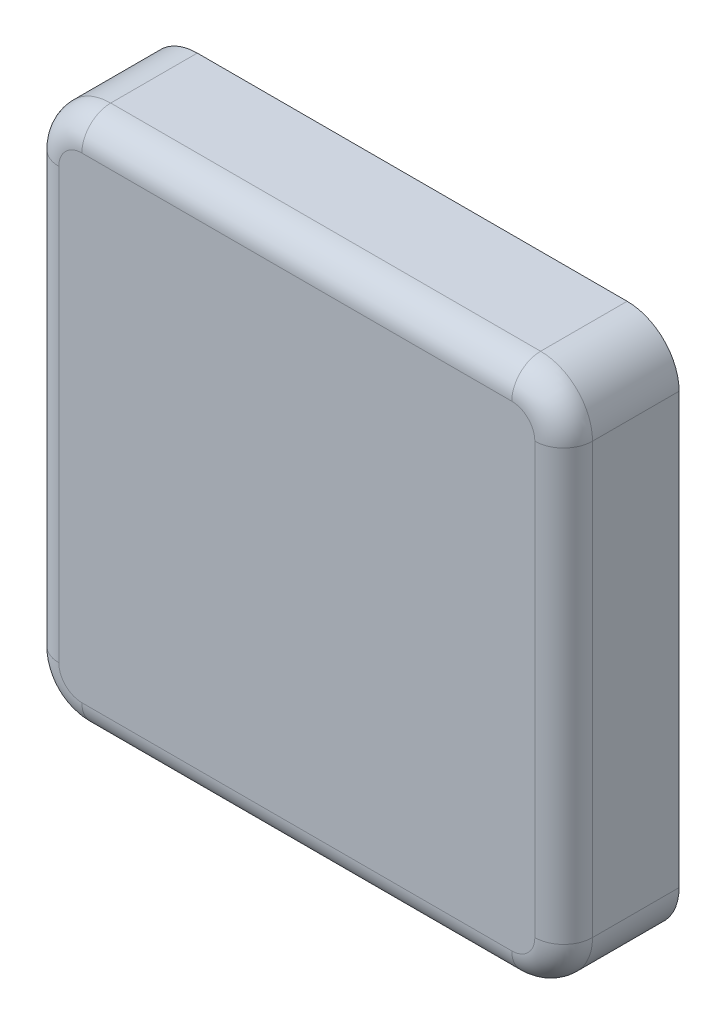
ISO-10303-21;
HEADER;
FILE_DESCRIPTION(('STEP AP214'),'2;1');
FILE_NAME('part.step','',(''),(''),'','','');
FILE_SCHEMA(('AUTOMOTIVE_DESIGN { 1 0 10303 214 1 1 1 1 }'));
ENDSEC;
DATA;
#1=APPLICATION_CONTEXT('core data for automotive mechanical design processes');
#2=APPLICATION_PROTOCOL_DEFINITION('international standard','automotive_design',2000,#1);
#3=PRODUCT_CONTEXT('',#1,'mechanical');
#4=PRODUCT('Part','Part','',(#3));
#5=PRODUCT_RELATED_PRODUCT_CATEGORY('part','',(#4));
#6=PRODUCT_DEFINITION_FORMATION('','',#4);
#7=PRODUCT_DEFINITION_CONTEXT('part definition',#1,'design');
#8=PRODUCT_DEFINITION('design','',#6,#7);
#9=PRODUCT_DEFINITION_SHAPE('','',#8);
#10=(LENGTH_UNIT() NAMED_UNIT(*) SI_UNIT(.MILLI.,.METRE.));
#11=(NAMED_UNIT(*) PLANE_ANGLE_UNIT() SI_UNIT($,.RADIAN.));
#12=(NAMED_UNIT(*) SI_UNIT($,.STERADIAN.) SOLID_ANGLE_UNIT());
#13=UNCERTAINTY_MEASURE_WITH_UNIT(LENGTH_MEASURE(1.E-05),#10,'distance_accuracy_value','');
#14=(GEOMETRIC_REPRESENTATION_CONTEXT(3) GLOBAL_UNCERTAINTY_ASSIGNED_CONTEXT((#13)) GLOBAL_UNIT_ASSIGNED_CONTEXT((#10,
#11,#12)) REPRESENTATION_CONTEXT('',''));
#15=CARTESIAN_POINT('',(0.,0.,0.));
#16=DIRECTION('',(0.,0.,1.));
#17=DIRECTION('',(1.,0.,0.));
#18=AXIS2_PLACEMENT_3D('',#15,#16,#17);
#19=CARTESIAN_POINT('',(0.,0.,0.));
#20=DIRECTION('',(0.,0.,-1.));
#21=DIRECTION('',(-1.,0.,0.));
#22=AXIS2_PLACEMENT_3D('',#19,#20,#21);
#23=PLANE('',#22);
#24=DIRECTION('',(-1.,0.,0.));
#25=VECTOR('',#24,1.);
#26=CARTESIAN_POINT('',(0.,8.65,0.));
#27=LINE('',#26,#25);
#28=CARTESIAN_POINT('',(8.65,8.65,0.));
#29=VERTEX_POINT('',#28);
#30=CARTESIAN_POINT('',(-8.65,8.65,0.));
#31=VERTEX_POINT('',#30);
#32=EDGE_CURVE('E291',#29,#31,#27,.T.);
#33=ORIENTED_EDGE('',*,*,#32,.T.);
#34=DIRECTION('',(0.,-1.,0.));
#35=VECTOR('',#34,1.);
#36=CARTESIAN_POINT('',(-8.65,0.,0.));
#37=LINE('',#36,#35);
#38=CARTESIAN_POINT('',(-8.65,-8.65,0.));
#39=VERTEX_POINT('',#38);
#40=EDGE_CURVE('E293',#31,#39,#37,.T.);
#41=ORIENTED_EDGE('',*,*,#40,.T.);
#42=DIRECTION('',(1.,0.,0.));
#43=VECTOR('',#42,1.);
#44=CARTESIAN_POINT('',(0.,-8.65,0.));
#45=LINE('',#44,#43);
#46=CARTESIAN_POINT('',(8.65,-8.65,0.));
#47=VERTEX_POINT('',#46);
#48=EDGE_CURVE('E267',#39,#47,#45,.T.);
#49=ORIENTED_EDGE('',*,*,#48,.T.);
#50=DIRECTION('',(0.,1.,0.));
#51=VECTOR('',#50,1.);
#52=CARTESIAN_POINT('',(8.65,0.,0.));
#53=LINE('',#52,#51);
#54=EDGE_CURVE('E289',#47,#29,#53,.T.);
#55=ORIENTED_EDGE('',*,*,#54,.T.);
#56=EDGE_LOOP('',(#33,#41,#49,#55));
#57=FACE_BOUND('',#56,.T.);
#58=DIRECTION('',(0.,-1.,0.));
#59=VECTOR('',#58,1.);
#60=CARTESIAN_POINT('',(-9.25,-9.25,0.));
#61=LINE('',#60,#59);
#62=CARTESIAN_POINT('',(-9.25,7.45,0.));
#63=VERTEX_POINT('',#62);
#64=CARTESIAN_POINT('',(-9.25,-7.45,0.));
#65=VERTEX_POINT('',#64);
#66=EDGE_CURVE('E199',#63,#65,#61,.T.);
#67=ORIENTED_EDGE('',*,*,#66,.F.);
#68=CARTESIAN_POINT('',(-7.45,7.45,0.));
#69=DIRECTION('',(0.,0.,-1.));
#70=DIRECTION('',(-1.,0.,0.));
#71=AXIS2_PLACEMENT_3D('',#68,#69,#70);
#72=CIRCLE('',#71,1.8);
#73=CARTESIAN_POINT('',(-7.45,9.25,0.));
#74=VERTEX_POINT('',#73);
#75=EDGE_CURVE('E216',#63,#74,#72,.T.);
#76=ORIENTED_EDGE('',*,*,#75,.T.);
#77=DIRECTION('',(-1.,0.,0.));
#78=VECTOR('',#77,1.);
#79=CARTESIAN_POINT('',(-9.25,9.25,0.));
#80=LINE('',#79,#78);
#81=CARTESIAN_POINT('',(7.45,9.25,0.));
#82=VERTEX_POINT('',#81);
#83=EDGE_CURVE('E195',#82,#74,#80,.T.);
#84=ORIENTED_EDGE('',*,*,#83,.F.);
#85=CARTESIAN_POINT('',(7.45,7.45,0.));
#86=DIRECTION('',(0.,0.,-1.));
#87=DIRECTION('',(-1.,0.,0.));
#88=AXIS2_PLACEMENT_3D('',#85,#86,#87);
#89=CIRCLE('',#88,1.8);
#90=CARTESIAN_POINT('',(9.25,7.45,0.));
#91=VERTEX_POINT('',#90);
#92=EDGE_CURVE('E210',#82,#91,#89,.T.);
#93=ORIENTED_EDGE('',*,*,#92,.T.);
#94=DIRECTION('',(0.,1.,0.));
#95=VECTOR('',#94,1.);
#96=CARTESIAN_POINT('',(9.25,-9.25,0.));
#97=LINE('',#96,#95);
#98=CARTESIAN_POINT('',(9.25,-7.45,0.));
#99=VERTEX_POINT('',#98);
#100=EDGE_CURVE('E192',#99,#91,#97,.T.);
#101=ORIENTED_EDGE('',*,*,#100,.F.);
#102=CARTESIAN_POINT('',(7.45,-7.45,0.));
#103=DIRECTION('',(0.,0.,-1.));
#104=DIRECTION('',(-1.,0.,0.));
#105=AXIS2_PLACEMENT_3D('',#102,#103,#104);
#106=CIRCLE('',#105,1.8);
#107=CARTESIAN_POINT('',(7.45,-9.25,0.));
#108=VERTEX_POINT('',#107);
#109=EDGE_CURVE('E212',#99,#108,#106,.T.);
#110=ORIENTED_EDGE('',*,*,#109,.T.);
#111=DIRECTION('',(1.,0.,0.));
#112=VECTOR('',#111,1.);
#113=CARTESIAN_POINT('',(-9.25,-9.25,0.));
#114=LINE('',#113,#112);
#115=CARTESIAN_POINT('',(-7.45,-9.25,0.));
#116=VERTEX_POINT('',#115);
#117=EDGE_CURVE('E202',#116,#108,#114,.T.);
#118=ORIENTED_EDGE('',*,*,#117,.F.);
#119=CARTESIAN_POINT('',(-7.45,-7.45,0.));
#120=DIRECTION('',(0.,0.,-1.));
#121=DIRECTION('',(-1.,0.,0.));
#122=AXIS2_PLACEMENT_3D('',#119,#120,#121);
#123=CIRCLE('',#122,1.8);
#124=EDGE_CURVE('E214',#116,#65,#123,.T.);
#125=ORIENTED_EDGE('',*,*,#124,.T.);
#126=EDGE_LOOP('',(#67,#76,#84,#93,#101,#110,#118,#125));
#127=FACE_BOUND('',#126,.T.);
#128=ADVANCED_FACE('F39',(#57,#127),#23,.T.);
#129=CARTESIAN_POINT('',(9.25,-9.25,4.));
#130=DIRECTION('',(-1.,0.,0.));
#131=DIRECTION('',(0.,0.,1.));
#132=AXIS2_PLACEMENT_3D('',#129,#130,#131);
#133=PLANE('',#132);
#134=DIRECTION('',(0.,0.,-1.));
#135=VECTOR('',#134,1.);
#136=CARTESIAN_POINT('',(9.25,7.45,4.));
#137=LINE('',#136,#135);
#138=CARTESIAN_POINT('',(9.25,7.45,3.));
#139=VERTEX_POINT('',#138);
#140=EDGE_CURVE('E228',#91,#139,#137,.F.);
#141=ORIENTED_EDGE('',*,*,#140,.T.);
#142=DIRECTION('',(0.,1.,0.));
#143=VECTOR('',#142,1.);
#144=CARTESIAN_POINT('',(9.25,-9.25,3.));
#145=LINE('',#144,#143);
#146=CARTESIAN_POINT('',(9.25,-7.45,3.));
#147=VERTEX_POINT('',#146);
#148=EDGE_CURVE('E253',#139,#147,#145,.F.);
#149=ORIENTED_EDGE('',*,*,#148,.T.);
#150=DIRECTION('',(0.,0.,-1.));
#151=VECTOR('',#150,1.);
#152=CARTESIAN_POINT('',(9.25,-7.45,4.));
#153=LINE('',#152,#151);
#154=EDGE_CURVE('E231',#147,#99,#153,.T.);
#155=ORIENTED_EDGE('',*,*,#154,.T.);
#156=ORIENTED_EDGE('',*,*,#100,.T.);
#157=EDGE_LOOP('',(#141,#149,#155,#156));
#158=FACE_BOUND('',#157,.T.);
#159=ADVANCED_FACE('F332',(#158),#133,.F.);
#160=CARTESIAN_POINT('',(-9.25,9.25,4.));
#161=DIRECTION('',(0.,-1.,0.));
#162=DIRECTION('',(0.,0.,-1.));
#163=AXIS2_PLACEMENT_3D('',#160,#161,#162);
#164=PLANE('',#163);
#165=DIRECTION('',(0.,0.,-1.));
#166=VECTOR('',#165,1.);
#167=CARTESIAN_POINT('',(-7.45,9.25,4.));
#168=LINE('',#167,#166);
#169=CARTESIAN_POINT('',(-7.45,9.25,3.));
#170=VERTEX_POINT('',#169);
#171=EDGE_CURVE('E220',#74,#170,#168,.F.);
#172=ORIENTED_EDGE('',*,*,#171,.T.);
#173=DIRECTION('',(-1.,0.,0.));
#174=VECTOR('',#173,1.);
#175=CARTESIAN_POINT('',(-9.25,9.25,3.));
#176=LINE('',#175,#174);
#177=CARTESIAN_POINT('',(7.45,9.25,3.));
#178=VERTEX_POINT('',#177);
#179=EDGE_CURVE('E265',#170,#178,#176,.F.);
#180=ORIENTED_EDGE('',*,*,#179,.T.);
#181=DIRECTION('',(0.,0.,-1.));
#182=VECTOR('',#181,1.);
#183=CARTESIAN_POINT('',(7.45,9.25,4.));
#184=LINE('',#183,#182);
#185=EDGE_CURVE('E218',#178,#82,#184,.T.);
#186=ORIENTED_EDGE('',*,*,#185,.T.);
#187=ORIENTED_EDGE('',*,*,#83,.T.);
#188=EDGE_LOOP('',(#172,#180,#186,#187));
#189=FACE_BOUND('',#188,.T.);
#190=ADVANCED_FACE('F372',(#189),#164,.F.);
#191=CARTESIAN_POINT('',(-9.25,-9.25,4.));
#192=DIRECTION('',(1.,0.,0.));
#193=DIRECTION('',(0.,0.,-1.));
#194=AXIS2_PLACEMENT_3D('',#191,#192,#193);
#195=PLANE('',#194);
#196=DIRECTION('',(0.,0.,-1.));
#197=VECTOR('',#196,1.);
#198=CARTESIAN_POINT('',(-9.25,-7.45,4.));
#199=LINE('',#198,#197);
#200=CARTESIAN_POINT('',(-9.25,-7.45,3.));
#201=VERTEX_POINT('',#200);
#202=EDGE_CURVE('E205',#65,#201,#199,.F.);
#203=ORIENTED_EDGE('',*,*,#202,.T.);
#204=DIRECTION('',(0.,-1.,0.));
#205=VECTOR('',#204,1.);
#206=CARTESIAN_POINT('',(-9.25,-9.25,3.));
#207=LINE('',#206,#205);
#208=CARTESIAN_POINT('',(-9.25,7.45,3.));
#209=VERTEX_POINT('',#208);
#210=EDGE_CURVE('E261',#201,#209,#207,.F.);
#211=ORIENTED_EDGE('',*,*,#210,.T.);
#212=DIRECTION('',(0.,0.,-1.));
#213=VECTOR('',#212,1.);
#214=CARTESIAN_POINT('',(-9.25,7.45,4.));
#215=LINE('',#214,#213);
#216=EDGE_CURVE('E208',#209,#63,#215,.T.);
#217=ORIENTED_EDGE('',*,*,#216,.T.);
#218=ORIENTED_EDGE('',*,*,#66,.T.);
#219=EDGE_LOOP('',(#203,#211,#217,#218));
#220=FACE_BOUND('',#219,.T.);
#221=ADVANCED_FACE('F341',(#220),#195,.F.);
#222=CARTESIAN_POINT('',(-9.25,-9.25,4.));
#223=DIRECTION('',(0.,1.,0.));
#224=DIRECTION('',(0.,0.,1.));
#225=AXIS2_PLACEMENT_3D('',#222,#223,#224);
#226=PLANE('',#225);
#227=DIRECTION('',(0.,0.,-1.));
#228=VECTOR('',#227,1.);
#229=CARTESIAN_POINT('',(7.45,-9.25,4.));
#230=LINE('',#229,#228);
#231=CARTESIAN_POINT('',(7.45,-9.25,3.));
#232=VERTEX_POINT('',#231);
#233=EDGE_CURVE('E223',#108,#232,#230,.F.);
#234=ORIENTED_EDGE('',*,*,#233,.T.);
#235=DIRECTION('',(1.,0.,0.));
#236=VECTOR('',#235,1.);
#237=CARTESIAN_POINT('',(-9.25,-9.25,3.));
#238=LINE('',#237,#236);
#239=CARTESIAN_POINT('',(-7.45,-9.25,3.));
#240=VERTEX_POINT('',#239);
#241=EDGE_CURVE('E257',#232,#240,#238,.F.);
#242=ORIENTED_EDGE('',*,*,#241,.T.);
#243=DIRECTION('',(0.,0.,-1.));
#244=VECTOR('',#243,1.);
#245=CARTESIAN_POINT('',(-7.45,-9.25,4.));
#246=LINE('',#245,#244);
#247=EDGE_CURVE('E226',#240,#116,#246,.T.);
#248=ORIENTED_EDGE('',*,*,#247,.T.);
#249=ORIENTED_EDGE('',*,*,#117,.T.);
#250=EDGE_LOOP('',(#234,#242,#248,#249));
#251=FACE_BOUND('',#250,.T.);
#252=ADVANCED_FACE('F399',(#251),#226,.F.);
#253=CARTESIAN_POINT('',(0.,0.,4.));
#254=DIRECTION('',(0.,0.,-1.));
#255=DIRECTION('',(-1.,0.,0.));
#256=AXIS2_PLACEMENT_3D('',#253,#254,#255);
#257=PLANE('',#256);
#258=DIRECTION('',(0.,1.,0.));
#259=VECTOR('',#258,1.);
#260=CARTESIAN_POINT('',(8.25,0.,4.));
#261=LINE('',#260,#259);
#262=CARTESIAN_POINT('',(8.25,-7.45,4.));
#263=VERTEX_POINT('',#262);
#264=CARTESIAN_POINT('',(8.25,7.45,4.));
#265=VERTEX_POINT('',#264);
#266=EDGE_CURVE('E245',#263,#265,#261,.T.);
#267=ORIENTED_EDGE('',*,*,#266,.T.);
#268=CARTESIAN_POINT('',(7.45,7.45,4.));
#269=DIRECTION('',(0.,0.,-1.));
#270=DIRECTION('',(-1.,0.,0.));
#271=AXIS2_PLACEMENT_3D('',#268,#269,#270);
#272=CIRCLE('',#271,0.8);
#273=CARTESIAN_POINT('',(7.45,8.25,4.));
#274=VERTEX_POINT('',#273);
#275=EDGE_CURVE('E247',#265,#274,#272,.F.);
#276=ORIENTED_EDGE('',*,*,#275,.T.);
#277=DIRECTION('',(-1.,0.,0.));
#278=VECTOR('',#277,1.);
#279=CARTESIAN_POINT('',(0.,8.25,4.));
#280=LINE('',#279,#278);
#281=CARTESIAN_POINT('',(-7.45,8.25,4.));
#282=VERTEX_POINT('',#281);
#283=EDGE_CURVE('E233',#274,#282,#280,.T.);
#284=ORIENTED_EDGE('',*,*,#283,.T.);
#285=CARTESIAN_POINT('',(-7.45,7.45,4.));
#286=DIRECTION('',(0.,0.,-1.));
#287=DIRECTION('',(-1.,0.,0.));
#288=AXIS2_PLACEMENT_3D('',#285,#286,#287);
#289=CIRCLE('',#288,0.8);
#290=CARTESIAN_POINT('',(-8.25,7.45,4.));
#291=VERTEX_POINT('',#290);
#292=EDGE_CURVE('E235',#282,#291,#289,.F.);
#293=ORIENTED_EDGE('',*,*,#292,.T.);
#294=DIRECTION('',(0.,-1.,0.));
#295=VECTOR('',#294,1.);
#296=CARTESIAN_POINT('',(-8.25,0.,4.));
#297=LINE('',#296,#295);
#298=CARTESIAN_POINT('',(-8.25,-7.45,4.));
#299=VERTEX_POINT('',#298);
#300=EDGE_CURVE('E237',#291,#299,#297,.T.);
#301=ORIENTED_EDGE('',*,*,#300,.T.);
#302=CARTESIAN_POINT('',(-7.45,-7.45,4.));
#303=DIRECTION('',(0.,0.,-1.));
#304=DIRECTION('',(-1.,0.,0.));
#305=AXIS2_PLACEMENT_3D('',#302,#303,#304);
#306=CIRCLE('',#305,0.8);
#307=CARTESIAN_POINT('',(-7.45,-8.25,4.));
#308=VERTEX_POINT('',#307);
#309=EDGE_CURVE('E239',#299,#308,#306,.F.);
#310=ORIENTED_EDGE('',*,*,#309,.T.);
#311=DIRECTION('',(1.,0.,0.));
#312=VECTOR('',#311,1.);
#313=CARTESIAN_POINT('',(0.,-8.25,4.));
#314=LINE('',#313,#312);
#315=CARTESIAN_POINT('',(7.45,-8.25,4.));
#316=VERTEX_POINT('',#315);
#317=EDGE_CURVE('E241',#308,#316,#314,.T.);
#318=ORIENTED_EDGE('',*,*,#317,.T.);
#319=CARTESIAN_POINT('',(7.45,-7.45,4.));
#320=DIRECTION('',(0.,0.,-1.));
#321=DIRECTION('',(-1.,0.,0.));
#322=AXIS2_PLACEMENT_3D('',#319,#320,#321);
#323=CIRCLE('',#322,0.8);
#324=EDGE_CURVE('E243',#316,#263,#323,.F.);
#325=ORIENTED_EDGE('',*,*,#324,.T.);
#326=EDGE_LOOP('',(#267,#276,#284,#293,#301,#310,#318,#325));
#327=FACE_BOUND('',#326,.T.);
#328=ADVANCED_FACE('F360',(#327),#257,.F.);
#329=CARTESIAN_POINT('',(-7.45,7.45,4.));
#330=DIRECTION('',(0.,0.,-1.));
#331=DIRECTION('',(-1.,0.,0.));
#332=AXIS2_PLACEMENT_3D('',#329,#330,#331);
#333=CYLINDRICAL_SURFACE('',#332,1.8);
#334=ORIENTED_EDGE('',*,*,#216,.F.);
#335=CARTESIAN_POINT('',(-7.45,7.45,3.));
#336=DIRECTION('',(0.,0.,-1.));
#337=DIRECTION('',(-1.,0.,0.));
#338=AXIS2_PLACEMENT_3D('',#335,#336,#337);
#339=CIRCLE('',#338,1.8);
#340=EDGE_CURVE('E263',#209,#170,#339,.T.);
#341=ORIENTED_EDGE('',*,*,#340,.T.);
#342=ORIENTED_EDGE('',*,*,#171,.F.);
#343=ORIENTED_EDGE('',*,*,#75,.F.);
#344=EDGE_LOOP('',(#334,#341,#342,#343));
#345=FACE_BOUND('',#344,.T.);
#346=ADVANCED_FACE('F368',(#345),#333,.T.);
#347=CARTESIAN_POINT('',(-7.45,-7.45,4.));
#348=DIRECTION('',(0.,0.,-1.));
#349=DIRECTION('',(-1.,0.,0.));
#350=AXIS2_PLACEMENT_3D('',#347,#348,#349);
#351=CYLINDRICAL_SURFACE('',#350,1.8);
#352=ORIENTED_EDGE('',*,*,#247,.F.);
#353=CARTESIAN_POINT('',(-7.45,-7.45,3.));
#354=DIRECTION('',(0.,0.,-1.));
#355=DIRECTION('',(-1.,0.,0.));
#356=AXIS2_PLACEMENT_3D('',#353,#354,#355);
#357=CIRCLE('',#356,1.8);
#358=EDGE_CURVE('E259',#240,#201,#357,.T.);
#359=ORIENTED_EDGE('',*,*,#358,.T.);
#360=ORIENTED_EDGE('',*,*,#202,.F.);
#361=ORIENTED_EDGE('',*,*,#124,.F.);
#362=EDGE_LOOP('',(#352,#359,#360,#361));
#363=FACE_BOUND('',#362,.T.);
#364=ADVANCED_FACE('F346',(#363),#351,.T.);
#365=CARTESIAN_POINT('',(7.45,-7.45,4.));
#366=DIRECTION('',(0.,0.,-1.));
#367=DIRECTION('',(-1.,0.,0.));
#368=AXIS2_PLACEMENT_3D('',#365,#366,#367);
#369=CYLINDRICAL_SURFACE('',#368,1.8);
#370=ORIENTED_EDGE('',*,*,#154,.F.);
#371=CARTESIAN_POINT('',(7.45,-7.45,3.));
#372=DIRECTION('',(0.,0.,-1.));
#373=DIRECTION('',(-1.,0.,0.));
#374=AXIS2_PLACEMENT_3D('',#371,#372,#373);
#375=CIRCLE('',#374,1.8);
#376=EDGE_CURVE('E255',#147,#232,#375,.T.);
#377=ORIENTED_EDGE('',*,*,#376,.T.);
#378=ORIENTED_EDGE('',*,*,#233,.F.);
#379=ORIENTED_EDGE('',*,*,#109,.F.);
#380=EDGE_LOOP('',(#370,#377,#378,#379));
#381=FACE_BOUND('',#380,.T.);
#382=ADVANCED_FACE('F400',(#381),#369,.T.);
#383=CARTESIAN_POINT('',(7.45,7.45,4.));
#384=DIRECTION('',(0.,0.,-1.));
#385=DIRECTION('',(-1.,0.,0.));
#386=AXIS2_PLACEMENT_3D('',#383,#384,#385);
#387=CYLINDRICAL_SURFACE('',#386,1.8);
#388=ORIENTED_EDGE('',*,*,#185,.F.);
#389=CARTESIAN_POINT('',(7.45,7.45,3.));
#390=DIRECTION('',(0.,0.,-1.));
#391=DIRECTION('',(-1.,0.,0.));
#392=AXIS2_PLACEMENT_3D('',#389,#390,#391);
#393=CIRCLE('',#392,1.8);
#394=EDGE_CURVE('E250',#178,#139,#393,.T.);
#395=ORIENTED_EDGE('',*,*,#394,.T.);
#396=ORIENTED_EDGE('',*,*,#140,.F.);
#397=ORIENTED_EDGE('',*,*,#92,.F.);
#398=EDGE_LOOP('',(#388,#395,#396,#397));
#399=FACE_BOUND('',#398,.T.);
#400=ADVANCED_FACE('F390',(#399),#387,.T.);
#401=CARTESIAN_POINT('',(-7.45,-7.45,3.));
#402=DIRECTION('',(0.,0.,-1.));
#403=DIRECTION('',(-1.,0.,0.));
#404=AXIS2_PLACEMENT_3D('',#401,#402,#403);
#405=DEGENERATE_TOROIDAL_SURFACE('',#404,0.8,1.,.T.);
#406=CARTESIAN_POINT('',(-8.25,-7.45,3.));
#407=DIRECTION('',(0.,1.,0.));
#408=DIRECTION('',(0.,0.,1.));
#409=AXIS2_PLACEMENT_3D('',#406,#407,#408);
#410=CIRCLE('',#409,1.);
#411=EDGE_CURVE('E283',#201,#299,#410,.T.);
#412=ORIENTED_EDGE('',*,*,#411,.F.);
#413=ORIENTED_EDGE('',*,*,#358,.F.);
#414=CARTESIAN_POINT('',(-7.45,-8.25,3.));
#415=DIRECTION('',(1.,0.,0.));
#416=DIRECTION('',(0.,0.,-1.));
#417=AXIS2_PLACEMENT_3D('',#414,#415,#416);
#418=CIRCLE('',#417,1.);
#419=EDGE_CURVE('E196',#308,#240,#418,.T.);
#420=ORIENTED_EDGE('',*,*,#419,.F.);
#421=ORIENTED_EDGE('',*,*,#309,.F.);
#422=EDGE_LOOP('',(#412,#413,#420,#421));
#423=FACE_BOUND('',#422,.T.);
#424=ADVANCED_FACE('F350',(#423),#405,.T.);
#425=CARTESIAN_POINT('',(0.,-8.25,3.));
#426=DIRECTION('',(1.,0.,0.));
#427=DIRECTION('',(0.,0.,-1.));
#428=AXIS2_PLACEMENT_3D('',#425,#426,#427);
#429=CYLINDRICAL_SURFACE('',#428,1.);
#430=ORIENTED_EDGE('',*,*,#419,.T.);
#431=ORIENTED_EDGE('',*,*,#241,.F.);
#432=CARTESIAN_POINT('',(7.45,-8.25,3.));
#433=DIRECTION('',(1.,0.,0.));
#434=DIRECTION('',(0.,0.,-1.));
#435=AXIS2_PLACEMENT_3D('',#432,#433,#434);
#436=CIRCLE('',#435,1.);
#437=EDGE_CURVE('E280',#316,#232,#436,.T.);
#438=ORIENTED_EDGE('',*,*,#437,.F.);
#439=ORIENTED_EDGE('',*,*,#317,.F.);
#440=EDGE_LOOP('',(#430,#431,#438,#439));
#441=FACE_BOUND('',#440,.T.);
#442=ADVANCED_FACE('F356',(#441),#429,.T.);
#443=CARTESIAN_POINT('',(-8.25,0.,3.));
#444=DIRECTION('',(0.,-1.,0.));
#445=DIRECTION('',(0.,0.,-1.));
#446=AXIS2_PLACEMENT_3D('',#443,#444,#445);
#447=CYLINDRICAL_SURFACE('',#446,1.);
#448=ORIENTED_EDGE('',*,*,#411,.T.);
#449=ORIENTED_EDGE('',*,*,#300,.F.);
#450=CARTESIAN_POINT('',(-8.25,7.45,3.));
#451=DIRECTION('',(0.,1.,0.));
#452=DIRECTION('',(0.,0.,1.));
#453=AXIS2_PLACEMENT_3D('',#450,#451,#452);
#454=CIRCLE('',#453,1.);
#455=EDGE_CURVE('E277',#209,#291,#454,.T.);
#456=ORIENTED_EDGE('',*,*,#455,.F.);
#457=ORIENTED_EDGE('',*,*,#210,.F.);
#458=EDGE_LOOP('',(#448,#449,#456,#457));
#459=FACE_BOUND('',#458,.T.);
#460=ADVANCED_FACE('F364',(#459),#447,.T.);
#461=CARTESIAN_POINT('',(7.45,-7.45,3.));
#462=DIRECTION('',(0.,0.,-1.));
#463=DIRECTION('',(-1.,0.,0.));
#464=AXIS2_PLACEMENT_3D('',#461,#462,#463);
#465=DEGENERATE_TOROIDAL_SURFACE('',#464,0.8,1.,.T.);
#466=ORIENTED_EDGE('',*,*,#437,.T.);
#467=ORIENTED_EDGE('',*,*,#376,.F.);
#468=CARTESIAN_POINT('',(8.25,-7.45,3.));
#469=DIRECTION('',(0.,1.,0.));
#470=DIRECTION('',(0.,0.,1.));
#471=AXIS2_PLACEMENT_3D('',#468,#469,#470);
#472=CIRCLE('',#471,1.);
#473=EDGE_CURVE('E274',#263,#147,#472,.T.);
#474=ORIENTED_EDGE('',*,*,#473,.F.);
#475=ORIENTED_EDGE('',*,*,#324,.F.);
#476=EDGE_LOOP('',(#466,#467,#474,#475));
#477=FACE_BOUND('',#476,.T.);
#478=ADVANCED_FACE('F403',(#477),#465,.T.);
#479=CARTESIAN_POINT('',(-7.45,7.45,3.));
#480=DIRECTION('',(0.,0.,-1.));
#481=DIRECTION('',(-1.,0.,0.));
#482=AXIS2_PLACEMENT_3D('',#479,#480,#481);
#483=DEGENERATE_TOROIDAL_SURFACE('',#482,0.8,1.,.T.);
#484=ORIENTED_EDGE('',*,*,#455,.T.);
#485=ORIENTED_EDGE('',*,*,#292,.F.);
#486=CARTESIAN_POINT('',(-7.45,8.25,3.));
#487=DIRECTION('',(1.,0.,0.));
#488=DIRECTION('',(0.,0.,-1.));
#489=AXIS2_PLACEMENT_3D('',#486,#487,#488);
#490=CIRCLE('',#489,1.);
#491=EDGE_CURVE('E271',#170,#282,#490,.T.);
#492=ORIENTED_EDGE('',*,*,#491,.F.);
#493=ORIENTED_EDGE('',*,*,#340,.F.);
#494=EDGE_LOOP('',(#484,#485,#492,#493));
#495=FACE_BOUND('',#494,.T.);
#496=ADVANCED_FACE('F377',(#495),#483,.T.);
#497=CARTESIAN_POINT('',(8.25,0.,3.));
#498=DIRECTION('',(0.,1.,0.));
#499=DIRECTION('',(0.,0.,1.));
#500=AXIS2_PLACEMENT_3D('',#497,#498,#499);
#501=CYLINDRICAL_SURFACE('',#500,1.);
#502=ORIENTED_EDGE('',*,*,#473,.T.);
#503=ORIENTED_EDGE('',*,*,#148,.F.);
#504=CARTESIAN_POINT('',(8.25,7.45,3.));
#505=DIRECTION('',(0.,1.,0.));
#506=DIRECTION('',(0.,0.,1.));
#507=AXIS2_PLACEMENT_3D('',#504,#505,#506);
#508=CIRCLE('',#507,1.);
#509=EDGE_CURVE('E269',#265,#139,#508,.T.);
#510=ORIENTED_EDGE('',*,*,#509,.F.);
#511=ORIENTED_EDGE('',*,*,#266,.F.);
#512=EDGE_LOOP('',(#502,#503,#510,#511));
#513=FACE_BOUND('',#512,.T.);
#514=ADVANCED_FACE('F406',(#513),#501,.T.);
#515=CARTESIAN_POINT('',(0.,8.25,3.));
#516=DIRECTION('',(-1.,0.,0.));
#517=DIRECTION('',(0.,0.,1.));
#518=AXIS2_PLACEMENT_3D('',#515,#516,#517);
#519=CYLINDRICAL_SURFACE('',#518,1.);
#520=ORIENTED_EDGE('',*,*,#491,.T.);
#521=ORIENTED_EDGE('',*,*,#283,.F.);
#522=CARTESIAN_POINT('',(7.45,8.25,3.));
#523=DIRECTION('',(1.,0.,0.));
#524=DIRECTION('',(0.,0.,-1.));
#525=AXIS2_PLACEMENT_3D('',#522,#523,#524);
#526=CIRCLE('',#525,1.);
#527=EDGE_CURVE('E191',#178,#274,#526,.T.);
#528=ORIENTED_EDGE('',*,*,#527,.F.);
#529=ORIENTED_EDGE('',*,*,#179,.F.);
#530=EDGE_LOOP('',(#520,#521,#528,#529));
#531=FACE_BOUND('',#530,.T.);
#532=ADVANCED_FACE('F381',(#531),#519,.T.);
#533=CARTESIAN_POINT('',(7.45,7.45,3.));
#534=DIRECTION('',(0.,0.,-1.));
#535=DIRECTION('',(-1.,0.,0.));
#536=AXIS2_PLACEMENT_3D('',#533,#534,#535);
#537=DEGENERATE_TOROIDAL_SURFACE('',#536,0.8,1.,.T.);
#538=ORIENTED_EDGE('',*,*,#509,.T.);
#539=ORIENTED_EDGE('',*,*,#394,.F.);
#540=ORIENTED_EDGE('',*,*,#527,.T.);
#541=ORIENTED_EDGE('',*,*,#275,.F.);
#542=EDGE_LOOP('',(#538,#539,#540,#541));
#543=FACE_BOUND('',#542,.T.);
#544=ADVANCED_FACE('F385',(#543),#537,.T.);
#545=CARTESIAN_POINT('',(7.25,-9.25,4.));
#546=DIRECTION('',(-1.,0.,0.));
#547=DIRECTION('',(0.,0.,1.));
#548=AXIS2_PLACEMENT_3D('',#545,#546,#547);
#549=PLANE('',#548);
#550=DIRECTION('',(0.,0.,1.));
#551=VECTOR('',#550,1.);
#552=CARTESIAN_POINT('',(7.25,7.25,4.));
#553=LINE('',#552,#551);
#554=CARTESIAN_POINT('',(7.25,7.25,1.4));
#555=VERTEX_POINT('',#554);
#556=CARTESIAN_POINT('',(7.25,7.25,2.));
#557=VERTEX_POINT('',#556);
#558=EDGE_CURVE('E163',#555,#557,#553,.T.);
#559=ORIENTED_EDGE('',*,*,#558,.F.);
#560=DIRECTION('',(0.,-1.,0.));
#561=VECTOR('',#560,1.);
#562=CARTESIAN_POINT('',(7.25,-9.25,1.4));
#563=LINE('',#562,#561);
#564=CARTESIAN_POINT('',(7.25,-7.25,1.4));
#565=VERTEX_POINT('',#564);
#566=EDGE_CURVE('E48',#555,#565,#563,.T.);
#567=ORIENTED_EDGE('',*,*,#566,.T.);
#568=DIRECTION('',(0.,0.,1.));
#569=VECTOR('',#568,1.);
#570=CARTESIAN_POINT('',(7.25,-7.25,4.));
#571=LINE('',#570,#569);
#572=CARTESIAN_POINT('',(7.25,-7.25,2.));
#573=VERTEX_POINT('',#572);
#574=EDGE_CURVE('E169',#565,#573,#571,.T.);
#575=ORIENTED_EDGE('',*,*,#574,.T.);
#576=DIRECTION('',(0.,-1.,0.));
#577=VECTOR('',#576,1.);
#578=CARTESIAN_POINT('',(7.25,-9.25,2.));
#579=LINE('',#578,#577);
#580=EDGE_CURVE('E172',#557,#573,#579,.T.);
#581=ORIENTED_EDGE('',*,*,#580,.F.);
#582=EDGE_LOOP('',(#559,#567,#575,#581));
#583=FACE_BOUND('',#582,.T.);
#584=ADVANCED_FACE('F173',(#583),#549,.T.);
#585=CARTESIAN_POINT('',(-9.25,7.25,4.));
#586=DIRECTION('',(0.,-1.,0.));
#587=DIRECTION('',(0.,0.,-1.));
#588=AXIS2_PLACEMENT_3D('',#585,#586,#587);
#589=PLANE('',#588);
#590=DIRECTION('',(0.,0.,1.));
#591=VECTOR('',#590,1.);
#592=CARTESIAN_POINT('',(-7.25,7.25,4.));
#593=LINE('',#592,#591);
#594=CARTESIAN_POINT('',(-7.25,7.25,1.4));
#595=VERTEX_POINT('',#594);
#596=CARTESIAN_POINT('',(-7.25,7.25,2.));
#597=VERTEX_POINT('',#596);
#598=EDGE_CURVE('E186',#595,#597,#593,.T.);
#599=ORIENTED_EDGE('',*,*,#598,.F.);
#600=DIRECTION('',(1.,0.,0.));
#601=VECTOR('',#600,1.);
#602=CARTESIAN_POINT('',(-9.25,7.25,1.4));
#603=LINE('',#602,#601);
#604=EDGE_CURVE('E63',#595,#555,#603,.T.);
#605=ORIENTED_EDGE('',*,*,#604,.T.);
#606=ORIENTED_EDGE('',*,*,#558,.T.);
#607=DIRECTION('',(-1.,0.,0.));
#608=VECTOR('',#607,1.);
#609=CARTESIAN_POINT('',(0.,7.25,2.));
#610=LINE('',#609,#608);
#611=EDGE_CURVE('E167',#557,#597,#610,.T.);
#612=ORIENTED_EDGE('',*,*,#611,.T.);
#613=EDGE_LOOP('',(#599,#605,#606,#612));
#614=FACE_BOUND('',#613,.T.);
#615=ADVANCED_FACE('F165',(#614),#589,.T.);
#616=CARTESIAN_POINT('',(-7.25,-9.25,4.));
#617=DIRECTION('',(1.,0.,0.));
#618=DIRECTION('',(0.,0.,-1.));
#619=AXIS2_PLACEMENT_3D('',#616,#617,#618);
#620=PLANE('',#619);
#621=DIRECTION('',(0.,0.,1.));
#622=VECTOR('',#621,1.);
#623=CARTESIAN_POINT('',(-7.25,-7.25,4.));
#624=LINE('',#623,#622);
#625=CARTESIAN_POINT('',(-7.25,-7.25,1.4));
#626=VERTEX_POINT('',#625);
#627=CARTESIAN_POINT('',(-7.25,-7.25,2.));
#628=VERTEX_POINT('',#627);
#629=EDGE_CURVE('E188',#626,#628,#624,.T.);
#630=ORIENTED_EDGE('',*,*,#629,.F.);
#631=DIRECTION('',(0.,1.,0.));
#632=VECTOR('',#631,1.);
#633=CARTESIAN_POINT('',(-7.25,-9.25,1.4));
#634=LINE('',#633,#632);
#635=EDGE_CURVE('E296',#626,#595,#634,.T.);
#636=ORIENTED_EDGE('',*,*,#635,.T.);
#637=ORIENTED_EDGE('',*,*,#598,.T.);
#638=DIRECTION('',(0.,-1.,0.));
#639=VECTOR('',#638,1.);
#640=CARTESIAN_POINT('',(-7.25,0.,2.));
#641=LINE('',#640,#639);
#642=EDGE_CURVE('E178',#597,#628,#641,.T.);
#643=ORIENTED_EDGE('',*,*,#642,.T.);
#644=EDGE_LOOP('',(#630,#636,#637,#643));
#645=FACE_BOUND('',#644,.T.);
#646=ADVANCED_FACE('F325',(#645),#620,.T.);
#647=CARTESIAN_POINT('',(-9.25,-7.25,4.));
#648=DIRECTION('',(0.,1.,0.));
#649=DIRECTION('',(0.,0.,1.));
#650=AXIS2_PLACEMENT_3D('',#647,#648,#649);
#651=PLANE('',#650);
#652=ORIENTED_EDGE('',*,*,#574,.F.);
#653=DIRECTION('',(-1.,0.,0.));
#654=VECTOR('',#653,1.);
#655=CARTESIAN_POINT('',(-9.25,-7.25,1.4));
#656=LINE('',#655,#654);
#657=EDGE_CURVE('E11',#565,#626,#656,.T.);
#658=ORIENTED_EDGE('',*,*,#657,.T.);
#659=ORIENTED_EDGE('',*,*,#629,.T.);
#660=DIRECTION('',(-1.,0.,0.));
#661=VECTOR('',#660,1.);
#662=CARTESIAN_POINT('',(-9.25,-7.25,2.));
#663=LINE('',#662,#661);
#664=EDGE_CURVE('E177',#573,#628,#663,.T.);
#665=ORIENTED_EDGE('',*,*,#664,.F.);
#666=EDGE_LOOP('',(#652,#658,#659,#665));
#667=FACE_BOUND('',#666,.T.);
#668=ADVANCED_FACE('F322',(#667),#651,.T.);
#669=CARTESIAN_POINT('',(0.,0.,2.));
#670=DIRECTION('',(0.,0.,-1.));
#671=DIRECTION('',(-1.,0.,0.));
#672=AXIS2_PLACEMENT_3D('',#669,#670,#671);
#673=PLANE('',#672);
#674=ORIENTED_EDGE('',*,*,#580,.T.);
#675=ORIENTED_EDGE('',*,*,#664,.T.);
#676=ORIENTED_EDGE('',*,*,#642,.F.);
#677=ORIENTED_EDGE('',*,*,#611,.F.);
#678=EDGE_LOOP('',(#674,#675,#676,#677));
#679=FACE_BOUND('',#678,.T.);
#680=ADVANCED_FACE('F180',(#679),#673,.T.);
#681=CARTESIAN_POINT('',(8.65,0.,0.));
#682=DIRECTION('',(0.707106781186549,0.,0.707106781186546));
#683=DIRECTION('',(0.,1.,0.));
#684=AXIS2_PLACEMENT_3D('',#681,#682,#683);
#685=PLANE('',#684);
#686=DIRECTION('',(0.577350269189625,-0.577350269189625,-0.577350269189628));
#687=VECTOR('',#686,1.);
#688=CARTESIAN_POINT('',(5.76666666666667,-5.76666666666667,2.88333333333334));
#689=LINE('',#688,#687);
#690=EDGE_CURVE('E304',#565,#47,#689,.T.);
#691=ORIENTED_EDGE('',*,*,#690,.F.);
#692=ORIENTED_EDGE('',*,*,#566,.F.);
#693=DIRECTION('',(0.577350269189625,0.577350269189625,-0.577350269189628));
#694=VECTOR('',#693,1.);
#695=CARTESIAN_POINT('',(5.76666666666667,5.76666666666667,2.88333333333334));
#696=LINE('',#695,#694);
#697=EDGE_CURVE('E43',#29,#555,#696,.F.);
#698=ORIENTED_EDGE('',*,*,#697,.F.);
#699=ORIENTED_EDGE('',*,*,#54,.F.);
#700=EDGE_LOOP('',(#691,#692,#698,#699));
#701=FACE_BOUND('',#700,.T.);
#702=ADVANCED_FACE('F41',(#701),#685,.F.);
#703=CARTESIAN_POINT('',(0.,8.65,0.));
#704=DIRECTION('',(0.,0.707106781186549,0.707106781186546));
#705=DIRECTION('',(-1.,0.,0.));
#706=AXIS2_PLACEMENT_3D('',#703,#704,#705);
#707=PLANE('',#706);
#708=ORIENTED_EDGE('',*,*,#697,.T.);
#709=ORIENTED_EDGE('',*,*,#604,.F.);
#710=DIRECTION('',(-0.577350269189625,0.577350269189625,-0.577350269189628));
#711=VECTOR('',#710,1.);
#712=CARTESIAN_POINT('',(-5.76666666666667,5.76666666666667,2.88333333333334));
#713=LINE('',#712,#711);
#714=EDGE_CURVE('E303',#31,#595,#713,.F.);
#715=ORIENTED_EDGE('',*,*,#714,.F.);
#716=ORIENTED_EDGE('',*,*,#32,.F.);
#717=EDGE_LOOP('',(#708,#709,#715,#716));
#718=FACE_BOUND('',#717,.T.);
#719=ADVANCED_FACE('F314',(#718),#707,.F.);
#720=CARTESIAN_POINT('',(0.,-8.65,0.));
#721=DIRECTION('',(0.,-0.707106781186549,0.707106781186546));
#722=DIRECTION('',(1.,0.,0.));
#723=AXIS2_PLACEMENT_3D('',#720,#721,#722);
#724=PLANE('',#723);
#725=ORIENTED_EDGE('',*,*,#690,.T.);
#726=ORIENTED_EDGE('',*,*,#48,.F.);
#727=DIRECTION('',(0.577350269189625,0.577350269189625,0.577350269189628));
#728=VECTOR('',#727,1.);
#729=CARTESIAN_POINT('',(-5.76666666666667,-5.76666666666667,2.88333333333334));
#730=LINE('',#729,#728);
#731=EDGE_CURVE('E301',#626,#39,#730,.F.);
#732=ORIENTED_EDGE('',*,*,#731,.F.);
#733=ORIENTED_EDGE('',*,*,#657,.F.);
#734=EDGE_LOOP('',(#725,#726,#732,#733));
#735=FACE_BOUND('',#734,.T.);
#736=ADVANCED_FACE('F319',(#735),#724,.F.);
#737=CARTESIAN_POINT('',(-8.65,0.,0.));
#738=DIRECTION('',(-0.707106781186549,0.,0.707106781186546));
#739=DIRECTION('',(0.,-1.,0.));
#740=AXIS2_PLACEMENT_3D('',#737,#738,#739);
#741=PLANE('',#740);
#742=ORIENTED_EDGE('',*,*,#714,.T.);
#743=ORIENTED_EDGE('',*,*,#635,.F.);
#744=ORIENTED_EDGE('',*,*,#731,.T.);
#745=ORIENTED_EDGE('',*,*,#40,.F.);
#746=EDGE_LOOP('',(#742,#743,#744,#745));
#747=FACE_BOUND('',#746,.T.);
#748=ADVANCED_FACE('F327',(#747),#741,.F.);
#749=CLOSED_SHELL('',(#128,#159,#190,#221,#252,#328,#346,#364,#382,#400,#424,#442,#460,#478,
#496,#514,#532,#544,#584,#615,#646,#668,#680,#702,#719,#736,#748));
#750=MANIFOLD_SOLID_BREP('B2',#749);
#751=ADVANCED_BREP_SHAPE_REPRESENTATION('',(#18,#750),#14);
#752=SHAPE_DEFINITION_REPRESENTATION(#9,#751);
ENDSEC;
END-ISO-10303-21;
